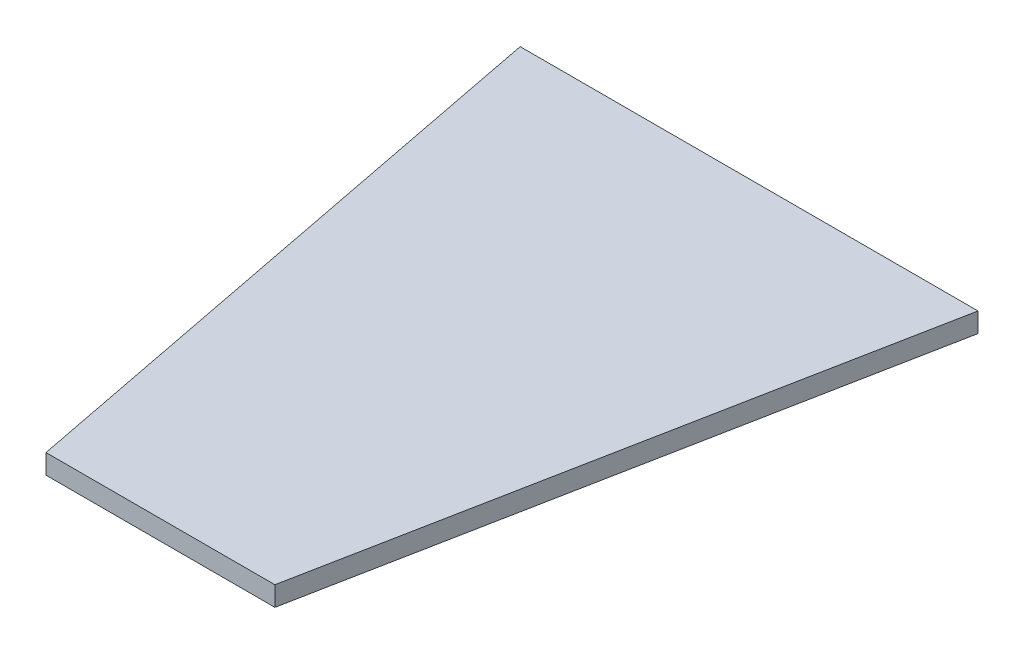
ISO-10303-21;
HEADER;
FILE_DESCRIPTION(('STEP AP214'),'2;1');
FILE_NAME('part.step','',(''),(''),'','','');
FILE_SCHEMA(('AUTOMOTIVE_DESIGN { 1 0 10303 214 1 1 1 1 }'));
ENDSEC;
DATA;
#1=APPLICATION_CONTEXT('core data for automotive mechanical design processes');
#2=APPLICATION_PROTOCOL_DEFINITION('international standard','automotive_design',2000,#1);
#3=PRODUCT_CONTEXT('',#1,'mechanical');
#4=PRODUCT('Part','Part','',(#3));
#5=PRODUCT_RELATED_PRODUCT_CATEGORY('part','',(#4));
#6=PRODUCT_DEFINITION_FORMATION('','',#4);
#7=PRODUCT_DEFINITION_CONTEXT('part definition',#1,'design');
#8=PRODUCT_DEFINITION('design','',#6,#7);
#9=PRODUCT_DEFINITION_SHAPE('','',#8);
#10=(LENGTH_UNIT() NAMED_UNIT(*) SI_UNIT(.MILLI.,.METRE.));
#11=(NAMED_UNIT(*) PLANE_ANGLE_UNIT() SI_UNIT($,.RADIAN.));
#12=(NAMED_UNIT(*) SI_UNIT($,.STERADIAN.) SOLID_ANGLE_UNIT());
#13=UNCERTAINTY_MEASURE_WITH_UNIT(LENGTH_MEASURE(1.E-05),#10,'distance_accuracy_value','');
#14=(GEOMETRIC_REPRESENTATION_CONTEXT(3) GLOBAL_UNCERTAINTY_ASSIGNED_CONTEXT((#13)) GLOBAL_UNIT_ASSIGNED_CONTEXT((#10,
#11,#12)) REPRESENTATION_CONTEXT('',''));
#15=CARTESIAN_POINT('',(0.,0.,0.));
#16=DIRECTION('',(0.,0.,1.));
#17=DIRECTION('',(1.,0.,0.));
#18=AXIS2_PLACEMENT_3D('',#15,#16,#17);
#19=CARTESIAN_POINT('',(-31.2365591397849,3.,-18.7231182795699));
#20=DIRECTION('',(0.981615389668581,0.,-0.190869659102224));
#21=DIRECTION('',(-0.190869659102224,0.,-0.981615389668581));
#22=AXIS2_PLACEMENT_3D('',#19,#20,#21);
#23=PLANE('',#22);
#24=DIRECTION('',(0.190869659102224,0.,0.981615389668581));
#25=VECTOR('',#24,1.);
#26=CARTESIAN_POINT('',(-31.2365591397849,0.,-18.7231182795699));
#27=LINE('',#26,#25);
#28=CARTESIAN_POINT('',(-31.2365591397849,0.,-18.7231182795699));
#29=VERTEX_POINT('',#28);
#30=CARTESIAN_POINT('',(-13.7365591397849,0.,71.2768817204301));
#31=VERTEX_POINT('',#30);
#32=EDGE_CURVE('E96',#29,#31,#27,.T.);
#33=ORIENTED_EDGE('',*,*,#32,.T.);
#34=DIRECTION('',(0.,-1.,0.));
#35=VECTOR('',#34,1.);
#36=CARTESIAN_POINT('',(-13.7365591397849,3.,71.2768817204301));
#37=LINE('',#36,#35);
#38=CARTESIAN_POINT('',(-13.7365591397849,3.,71.2768817204301));
#39=VERTEX_POINT('',#38);
#40=EDGE_CURVE('E11',#39,#31,#37,.T.);
#41=ORIENTED_EDGE('',*,*,#40,.F.);
#42=DIRECTION('',(0.190869659102224,0.,0.981615389668581));
#43=VECTOR('',#42,1.);
#44=CARTESIAN_POINT('',(-31.2365591397849,3.,-18.7231182795699));
#45=LINE('',#44,#43);
#46=CARTESIAN_POINT('',(-31.2365591397849,3.,-18.7231182795699));
#47=VERTEX_POINT('',#46);
#48=EDGE_CURVE('E84',#47,#39,#45,.T.);
#49=ORIENTED_EDGE('',*,*,#48,.F.);
#50=DIRECTION('',(0.,-1.,0.));
#51=VECTOR('',#50,1.);
#52=CARTESIAN_POINT('',(-31.2365591397849,3.,-18.7231182795699));
#53=LINE('',#52,#51);
#54=EDGE_CURVE('E92',#47,#29,#53,.T.);
#55=ORIENTED_EDGE('',*,*,#54,.T.);
#56=EDGE_LOOP('',(#33,#41,#49,#55));
#57=FACE_BOUND('',#56,.T.);
#58=ADVANCED_FACE('F33',(#57),#23,.F.);
#59=CARTESIAN_POINT('',(-13.7365591397849,3.,71.2768817204301));
#60=DIRECTION('',(0.,0.,-1.));
#61=DIRECTION('',(-1.,0.,0.));
#62=AXIS2_PLACEMENT_3D('',#59,#60,#61);
#63=PLANE('',#62);
#64=DIRECTION('',(1.,0.,0.));
#65=VECTOR('',#64,1.);
#66=CARTESIAN_POINT('',(-13.7365591397849,0.,71.2768817204301));
#67=LINE('',#66,#65);
#68=CARTESIAN_POINT('',(21.2634408602151,0.,71.2768817204301));
#69=VERTEX_POINT('',#68);
#70=EDGE_CURVE('E88',#31,#69,#67,.T.);
#71=ORIENTED_EDGE('',*,*,#70,.T.);
#72=DIRECTION('',(0.,-1.,0.));
#73=VECTOR('',#72,1.);
#74=CARTESIAN_POINT('',(21.2634408602151,3.,71.2768817204301));
#75=LINE('',#74,#73);
#76=CARTESIAN_POINT('',(21.2634408602151,3.,71.2768817204301));
#77=VERTEX_POINT('',#76);
#78=EDGE_CURVE('E41',#77,#69,#75,.T.);
#79=ORIENTED_EDGE('',*,*,#78,.F.);
#80=DIRECTION('',(1.,0.,0.));
#81=VECTOR('',#80,1.);
#82=CARTESIAN_POINT('',(-13.7365591397849,3.,71.2768817204301));
#83=LINE('',#82,#81);
#84=EDGE_CURVE('E79',#39,#77,#83,.T.);
#85=ORIENTED_EDGE('',*,*,#84,.F.);
#86=ORIENTED_EDGE('',*,*,#40,.T.);
#87=EDGE_LOOP('',(#71,#79,#85,#86));
#88=FACE_BOUND('',#87,.T.);
#89=ADVANCED_FACE('F87',(#88),#63,.F.);
#90=CARTESIAN_POINT('',(21.2634408602151,3.,71.2768817204301));
#91=DIRECTION('',(-0.981615389668581,0.,-0.190869659102224));
#92=DIRECTION('',(-0.190869659102224,0.,0.981615389668581));
#93=AXIS2_PLACEMENT_3D('',#90,#91,#92);
#94=PLANE('',#93);
#95=DIRECTION('',(0.190869659102224,0.,-0.981615389668581));
#96=VECTOR('',#95,1.);
#97=CARTESIAN_POINT('',(21.2634408602151,0.,71.2768817204301));
#98=LINE('',#97,#96);
#99=CARTESIAN_POINT('',(38.7634408602151,0.,-18.7231182795699));
#100=VERTEX_POINT('',#99);
#101=EDGE_CURVE('E66',#69,#100,#98,.T.);
#102=ORIENTED_EDGE('',*,*,#101,.T.);
#103=DIRECTION('',(0.,-1.,0.));
#104=VECTOR('',#103,1.);
#105=CARTESIAN_POINT('',(38.7634408602151,3.,-18.7231182795699));
#106=LINE('',#105,#104);
#107=CARTESIAN_POINT('',(38.7634408602151,3.,-18.7231182795699));
#108=VERTEX_POINT('',#107);
#109=EDGE_CURVE('E89',#108,#100,#106,.T.);
#110=ORIENTED_EDGE('',*,*,#109,.F.);
#111=DIRECTION('',(0.190869659102224,0.,-0.981615389668581));
#112=VECTOR('',#111,1.);
#113=CARTESIAN_POINT('',(21.2634408602151,3.,71.2768817204301));
#114=LINE('',#113,#112);
#115=EDGE_CURVE('E82',#77,#108,#114,.T.);
#116=ORIENTED_EDGE('',*,*,#115,.F.);
#117=ORIENTED_EDGE('',*,*,#78,.T.);
#118=EDGE_LOOP('',(#102,#110,#116,#117));
#119=FACE_BOUND('',#118,.T.);
#120=ADVANCED_FACE('F90',(#119),#94,.F.);
#121=CARTESIAN_POINT('',(-31.2365591397849,3.,-18.7231182795699));
#122=DIRECTION('',(0.,0.,1.));
#123=DIRECTION('',(1.,0.,0.));
#124=AXIS2_PLACEMENT_3D('',#121,#122,#123);
#125=PLANE('',#124);
#126=DIRECTION('',(-1.,0.,0.));
#127=VECTOR('',#126,1.);
#128=CARTESIAN_POINT('',(-31.2365591397849,0.,-18.7231182795699));
#129=LINE('',#128,#127);
#130=EDGE_CURVE('E72',#100,#29,#129,.T.);
#131=ORIENTED_EDGE('',*,*,#130,.T.);
#132=ORIENTED_EDGE('',*,*,#54,.F.);
#133=DIRECTION('',(-1.,0.,0.));
#134=VECTOR('',#133,1.);
#135=CARTESIAN_POINT('',(-31.2365591397849,3.,-18.7231182795699));
#136=LINE('',#135,#134);
#137=EDGE_CURVE('E49',#108,#47,#136,.T.);
#138=ORIENTED_EDGE('',*,*,#137,.F.);
#139=ORIENTED_EDGE('',*,*,#109,.T.);
#140=EDGE_LOOP('',(#131,#132,#138,#139));
#141=FACE_BOUND('',#140,.T.);
#142=ADVANCED_FACE('F103',(#141),#125,.F.);
#143=CARTESIAN_POINT('',(0.,3.,0.));
#144=DIRECTION('',(0.,1.,0.));
#145=DIRECTION('',(0.,0.,1.));
#146=AXIS2_PLACEMENT_3D('',#143,#144,#145);
#147=PLANE('',#146);
#148=ORIENTED_EDGE('',*,*,#48,.T.);
#149=ORIENTED_EDGE('',*,*,#84,.T.);
#150=ORIENTED_EDGE('',*,*,#115,.T.);
#151=ORIENTED_EDGE('',*,*,#137,.T.);
#152=EDGE_LOOP('',(#148,#149,#150,#151));
#153=FACE_BOUND('',#152,.T.);
#154=ADVANCED_FACE('F80',(#153),#147,.T.);
#155=CARTESIAN_POINT('',(0.,0.,0.));
#156=DIRECTION('',(0.,1.,0.));
#157=DIRECTION('',(0.,0.,1.));
#158=AXIS2_PLACEMENT_3D('',#155,#156,#157);
#159=PLANE('',#158);
#160=ORIENTED_EDGE('',*,*,#32,.F.);
#161=ORIENTED_EDGE('',*,*,#130,.F.);
#162=ORIENTED_EDGE('',*,*,#101,.F.);
#163=ORIENTED_EDGE('',*,*,#70,.F.);
#164=EDGE_LOOP('',(#160,#161,#162,#163));
#165=FACE_BOUND('',#164,.T.);
#166=ADVANCED_FACE('F106',(#165),#159,.F.);
#167=CLOSED_SHELL('',(#58,#89,#120,#142,#154,#166));
#168=MANIFOLD_SOLID_BREP('B2',#167);
#169=ADVANCED_BREP_SHAPE_REPRESENTATION('',(#18,#168),#14);
#170=SHAPE_DEFINITION_REPRESENTATION(#9,#169);
ENDSEC;
END-ISO-10303-21;
